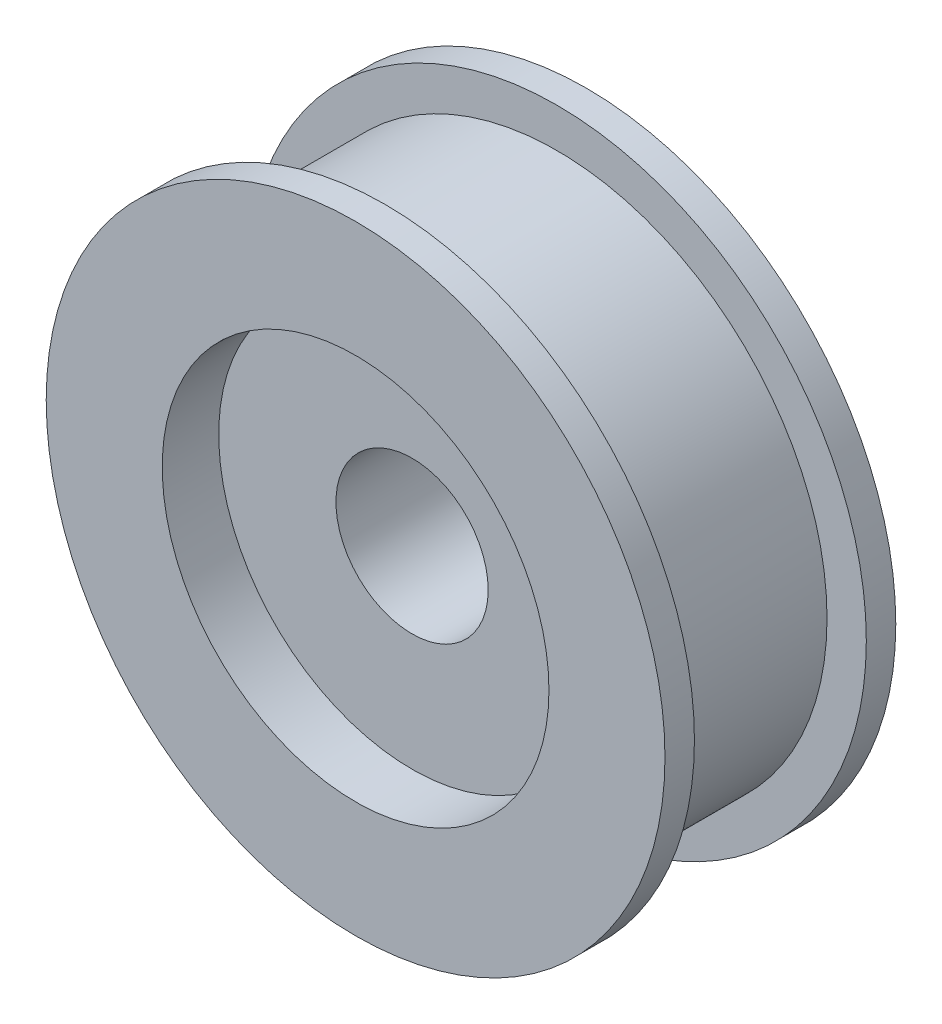
ISO-10303-21;
HEADER;
FILE_DESCRIPTION(('STEP AP214'),'2;1');
FILE_NAME('part.step','',(''),(''),'','','');
FILE_SCHEMA(('AUTOMOTIVE_DESIGN { 1 0 10303 214 1 1 1 1 }'));
ENDSEC;
DATA;
#1=APPLICATION_CONTEXT('core data for automotive mechanical design processes');
#2=APPLICATION_PROTOCOL_DEFINITION('international standard','automotive_design',2000,#1);
#3=PRODUCT_CONTEXT('',#1,'mechanical');
#4=PRODUCT('Part','Part','',(#3));
#5=PRODUCT_RELATED_PRODUCT_CATEGORY('part','',(#4));
#6=PRODUCT_DEFINITION_FORMATION('','',#4);
#7=PRODUCT_DEFINITION_CONTEXT('part definition',#1,'design');
#8=PRODUCT_DEFINITION('design','',#6,#7);
#9=PRODUCT_DEFINITION_SHAPE('','',#8);
#10=(LENGTH_UNIT() NAMED_UNIT(*) SI_UNIT(.MILLI.,.METRE.));
#11=(NAMED_UNIT(*) PLANE_ANGLE_UNIT() SI_UNIT($,.RADIAN.));
#12=(NAMED_UNIT(*) SI_UNIT($,.STERADIAN.) SOLID_ANGLE_UNIT());
#13=UNCERTAINTY_MEASURE_WITH_UNIT(LENGTH_MEASURE(1.E-05),#10,'distance_accuracy_value','');
#14=(GEOMETRIC_REPRESENTATION_CONTEXT(3) GLOBAL_UNCERTAINTY_ASSIGNED_CONTEXT((#13)) GLOBAL_UNIT_ASSIGNED_CONTEXT((#10,
#11,#12)) REPRESENTATION_CONTEXT('',''));
#15=CARTESIAN_POINT('',(0.,0.,0.));
#16=DIRECTION('',(0.,0.,1.));
#17=DIRECTION('',(1.,0.,0.));
#18=AXIS2_PLACEMENT_3D('',#15,#16,#17);
#19=CARTESIAN_POINT('',(0.,0.,-4.7));
#20=DIRECTION('',(0.,0.,1.));
#21=DIRECTION('',(1.,0.,0.));
#22=AXIS2_PLACEMENT_3D('',#19,#20,#21);
#23=CYLINDRICAL_SURFACE('',#22,12.6);
#24=CARTESIAN_POINT('',(0.,0.,-4.7));
#25=DIRECTION('',(0.,0.,1.));
#26=DIRECTION('',(1.,0.,0.));
#27=AXIS2_PLACEMENT_3D('',#24,#25,#26);
#28=CIRCLE('',#27,12.6);
#29=CARTESIAN_POINT('',(12.6,0.,-4.7));
#30=VERTEX_POINT('',#29);
#31=EDGE_CURVE('E50',#30,#30,#28,.T.);
#32=ORIENTED_EDGE('',*,*,#31,.T.);
#33=EDGE_LOOP('',(#32));
#34=FACE_BOUND('',#33,.T.);
#35=CARTESIAN_POINT('',(0.,0.,-3.5));
#36=DIRECTION('',(0.,0.,1.));
#37=DIRECTION('',(1.,0.,0.));
#38=AXIS2_PLACEMENT_3D('',#35,#36,#37);
#39=CIRCLE('',#38,12.6);
#40=CARTESIAN_POINT('',(12.6,0.,-3.5));
#41=VERTEX_POINT('',#40);
#42=EDGE_CURVE('E62',#41,#41,#39,.T.);
#43=ORIENTED_EDGE('',*,*,#42,.F.);
#44=EDGE_LOOP('',(#43));
#45=FACE_BOUND('',#44,.T.);
#46=ADVANCED_FACE('F30',(#34,#45),#23,.T.);
#47=CARTESIAN_POINT('',(0.,0.,2.4));
#48=DIRECTION('',(0.,0.,1.));
#49=DIRECTION('',(1.,0.,0.));
#50=AXIS2_PLACEMENT_3D('',#47,#48,#49);
#51=PLANE('',#50);
#52=CARTESIAN_POINT('',(0.,0.,2.4));
#53=DIRECTION('',(0.,0.,1.));
#54=DIRECTION('',(1.,0.,0.));
#55=AXIS2_PLACEMENT_3D('',#52,#53,#54);
#56=CIRCLE('',#55,7.875);
#57=CARTESIAN_POINT('',(7.875,0.,2.4));
#58=VERTEX_POINT('',#57);
#59=EDGE_CURVE('E46',#58,#58,#56,.T.);
#60=ORIENTED_EDGE('',*,*,#59,.T.);
#61=EDGE_LOOP('',(#60));
#62=FACE_BOUND('',#61,.T.);
#63=CARTESIAN_POINT('',(0.,0.,2.4));
#64=DIRECTION('',(0.,0.,1.));
#65=DIRECTION('',(1.,0.,0.));
#66=AXIS2_PLACEMENT_3D('',#63,#64,#65);
#67=CIRCLE('',#66,3.1);
#68=CARTESIAN_POINT('',(3.1,0.,2.4));
#69=VERTEX_POINT('',#68);
#70=EDGE_CURVE('E37',#69,#69,#67,.T.);
#71=ORIENTED_EDGE('',*,*,#70,.F.);
#72=EDGE_LOOP('',(#71));
#73=FACE_BOUND('',#72,.T.);
#74=ADVANCED_FACE('F87',(#62,#73),#51,.T.);
#75=CARTESIAN_POINT('',(0.,0.,-2.4));
#76=DIRECTION('',(0.,0.,1.));
#77=DIRECTION('',(1.,0.,0.));
#78=AXIS2_PLACEMENT_3D('',#75,#76,#77);
#79=PLANE('',#78);
#80=CARTESIAN_POINT('',(0.,0.,-2.4));
#81=DIRECTION('',(0.,0.,1.));
#82=DIRECTION('',(1.,0.,0.));
#83=AXIS2_PLACEMENT_3D('',#80,#81,#82);
#84=CIRCLE('',#83,7.875);
#85=CARTESIAN_POINT('',(7.875,0.,-2.4));
#86=VERTEX_POINT('',#85);
#87=EDGE_CURVE('E10',#86,#86,#84,.T.);
#88=ORIENTED_EDGE('',*,*,#87,.F.);
#89=EDGE_LOOP('',(#88));
#90=FACE_BOUND('',#89,.T.);
#91=CARTESIAN_POINT('',(0.,0.,-2.4));
#92=DIRECTION('',(0.,0.,1.));
#93=DIRECTION('',(1.,0.,0.));
#94=AXIS2_PLACEMENT_3D('',#91,#92,#93);
#95=CIRCLE('',#94,3.1);
#96=CARTESIAN_POINT('',(3.1,0.,-2.4));
#97=VERTEX_POINT('',#96);
#98=EDGE_CURVE('E41',#97,#97,#95,.T.);
#99=ORIENTED_EDGE('',*,*,#98,.T.);
#100=EDGE_LOOP('',(#99));
#101=FACE_BOUND('',#100,.T.);
#102=ADVANCED_FACE('F32',(#90,#101),#79,.F.);
#103=CARTESIAN_POINT('',(0.,0.,2.4));
#104=DIRECTION('',(0.,0.,-1.));
#105=DIRECTION('',(-1.,0.,0.));
#106=AXIS2_PLACEMENT_3D('',#103,#104,#105);
#107=CYLINDRICAL_SURFACE('',#106,3.1);
#108=ORIENTED_EDGE('',*,*,#70,.T.);
#109=EDGE_LOOP('',(#108));
#110=FACE_BOUND('',#109,.T.);
#111=ORIENTED_EDGE('',*,*,#98,.F.);
#112=EDGE_LOOP('',(#111));
#113=FACE_BOUND('',#112,.T.);
#114=ADVANCED_FACE('F107',(#110,#113),#107,.F.);
#115=CARTESIAN_POINT('',(0.,0.,-4.7));
#116=DIRECTION('',(0.,0.,1.));
#117=DIRECTION('',(1.,0.,0.));
#118=AXIS2_PLACEMENT_3D('',#115,#116,#117);
#119=CYLINDRICAL_SURFACE('',#118,7.875);
#120=CARTESIAN_POINT('',(0.,0.,-4.7));
#121=DIRECTION('',(0.,0.,1.));
#122=DIRECTION('',(1.,0.,0.));
#123=AXIS2_PLACEMENT_3D('',#120,#121,#122);
#124=CIRCLE('',#123,7.875);
#125=CARTESIAN_POINT('',(7.875,0.,-4.7));
#126=VERTEX_POINT('',#125);
#127=EDGE_CURVE('E53',#126,#126,#124,.T.);
#128=ORIENTED_EDGE('',*,*,#127,.F.);
#129=EDGE_LOOP('',(#128));
#130=FACE_BOUND('',#129,.T.);
#131=ORIENTED_EDGE('',*,*,#87,.T.);
#132=EDGE_LOOP('',(#131));
#133=FACE_BOUND('',#132,.T.);
#134=ADVANCED_FACE('F99',(#130,#133),#119,.F.);
#135=CARTESIAN_POINT('',(0.,0.,3.5));
#136=DIRECTION('',(0.,0.,1.));
#137=DIRECTION('',(1.,0.,0.));
#138=AXIS2_PLACEMENT_3D('',#135,#136,#137);
#139=CIRCLE('',#138,12.6);
#140=CARTESIAN_POINT('',(12.6,0.,3.5));
#141=VERTEX_POINT('',#140);
#142=EDGE_CURVE('E63',#141,#141,#139,.T.);
#143=ORIENTED_EDGE('',*,*,#142,.T.);
#144=EDGE_LOOP('',(#143));
#145=FACE_BOUND('',#144,.T.);
#146=CARTESIAN_POINT('',(0.,0.,4.7));
#147=DIRECTION('',(0.,0.,1.));
#148=DIRECTION('',(1.,0.,0.));
#149=AXIS2_PLACEMENT_3D('',#146,#147,#148);
#150=CIRCLE('',#149,12.6);
#151=CARTESIAN_POINT('',(12.6,0.,4.7));
#152=VERTEX_POINT('',#151);
#153=EDGE_CURVE('E56',#152,#152,#150,.T.);
#154=ORIENTED_EDGE('',*,*,#153,.F.);
#155=EDGE_LOOP('',(#154));
#156=FACE_BOUND('',#155,.T.);
#157=ADVANCED_FACE('F90',(#145,#156),#23,.T.);
#158=CARTESIAN_POINT('',(0.,0.,-4.7));
#159=DIRECTION('',(0.,0.,1.));
#160=DIRECTION('',(1.,0.,0.));
#161=AXIS2_PLACEMENT_3D('',#158,#159,#160);
#162=PLANE('',#161);
#163=ORIENTED_EDGE('',*,*,#127,.T.);
#164=EDGE_LOOP('',(#163));
#165=FACE_BOUND('',#164,.T.);
#166=ORIENTED_EDGE('',*,*,#31,.F.);
#167=EDGE_LOOP('',(#166));
#168=FACE_BOUND('',#167,.T.);
#169=ADVANCED_FACE('F98',(#165,#168),#162,.F.);
#170=ORIENTED_EDGE('',*,*,#59,.F.);
#171=EDGE_LOOP('',(#170));
#172=FACE_BOUND('',#171,.T.);
#173=CARTESIAN_POINT('',(0.,0.,4.7));
#174=DIRECTION('',(0.,0.,1.));
#175=DIRECTION('',(1.,0.,0.));
#176=AXIS2_PLACEMENT_3D('',#173,#174,#175);
#177=CIRCLE('',#176,7.875);
#178=CARTESIAN_POINT('',(7.875,0.,4.7));
#179=VERTEX_POINT('',#178);
#180=EDGE_CURVE('E59',#179,#179,#177,.T.);
#181=ORIENTED_EDGE('',*,*,#180,.T.);
#182=EDGE_LOOP('',(#181));
#183=FACE_BOUND('',#182,.T.);
#184=ADVANCED_FACE('F105',(#172,#183),#119,.F.);
#185=CARTESIAN_POINT('',(0.,0.,4.7));
#186=DIRECTION('',(0.,0.,1.));
#187=DIRECTION('',(1.,0.,0.));
#188=AXIS2_PLACEMENT_3D('',#185,#186,#187);
#189=PLANE('',#188);
#190=ORIENTED_EDGE('',*,*,#153,.T.);
#191=EDGE_LOOP('',(#190));
#192=FACE_BOUND('',#191,.T.);
#193=ORIENTED_EDGE('',*,*,#180,.F.);
#194=EDGE_LOOP('',(#193));
#195=FACE_BOUND('',#194,.T.);
#196=ADVANCED_FACE('F82',(#192,#195),#189,.T.);
#197=CARTESIAN_POINT('',(0.,0.,-3.5));
#198=DIRECTION('',(0.,0.,1.));
#199=DIRECTION('',(1.,0.,0.));
#200=AXIS2_PLACEMENT_3D('',#197,#198,#199);
#201=PLANE('',#200);
#202=CARTESIAN_POINT('',(0.,0.,-3.5));
#203=DIRECTION('',(0.,0.,1.));
#204=DIRECTION('',(1.,0.,0.));
#205=AXIS2_PLACEMENT_3D('',#202,#203,#204);
#206=CIRCLE('',#205,11.);
#207=CARTESIAN_POINT('',(11.,0.,-3.5));
#208=VERTEX_POINT('',#207);
#209=EDGE_CURVE('E66',#208,#208,#206,.T.);
#210=ORIENTED_EDGE('',*,*,#209,.F.);
#211=EDGE_LOOP('',(#210));
#212=FACE_BOUND('',#211,.T.);
#213=ORIENTED_EDGE('',*,*,#42,.T.);
#214=EDGE_LOOP('',(#213));
#215=FACE_BOUND('',#214,.T.);
#216=ADVANCED_FACE('F78',(#212,#215),#201,.T.);
#217=CARTESIAN_POINT('',(0.,0.,3.5));
#218=DIRECTION('',(0.,0.,1.));
#219=DIRECTION('',(1.,0.,0.));
#220=AXIS2_PLACEMENT_3D('',#217,#218,#219);
#221=PLANE('',#220);
#222=CARTESIAN_POINT('',(0.,0.,3.5));
#223=DIRECTION('',(0.,0.,1.));
#224=DIRECTION('',(1.,0.,0.));
#225=AXIS2_PLACEMENT_3D('',#222,#223,#224);
#226=CIRCLE('',#225,11.);
#227=CARTESIAN_POINT('',(11.,0.,3.5));
#228=VERTEX_POINT('',#227);
#229=EDGE_CURVE('E69',#228,#228,#226,.T.);
#230=ORIENTED_EDGE('',*,*,#229,.T.);
#231=EDGE_LOOP('',(#230));
#232=FACE_BOUND('',#231,.T.);
#233=ORIENTED_EDGE('',*,*,#142,.F.);
#234=EDGE_LOOP('',(#233));
#235=FACE_BOUND('',#234,.T.);
#236=ADVANCED_FACE('F81',(#232,#235),#221,.F.);
#237=CARTESIAN_POINT('',(0.,0.,-3.5));
#238=DIRECTION('',(0.,0.,1.));
#239=DIRECTION('',(1.,0.,0.));
#240=AXIS2_PLACEMENT_3D('',#237,#238,#239);
#241=CYLINDRICAL_SURFACE('',#240,11.);
#242=ORIENTED_EDGE('',*,*,#209,.T.);
#243=EDGE_LOOP('',(#242));
#244=FACE_BOUND('',#243,.T.);
#245=ORIENTED_EDGE('',*,*,#229,.F.);
#246=EDGE_LOOP('',(#245));
#247=FACE_BOUND('',#246,.T.);
#248=ADVANCED_FACE('F75',(#244,#247),#241,.T.);
#249=CLOSED_SHELL('',(#46,#74,#102,#114,#134,#157,#169,#184,#196,#216,#236,#248));
#250=MANIFOLD_SOLID_BREP('B2',#249);
#251=ADVANCED_BREP_SHAPE_REPRESENTATION('',(#18,#250),#14);
#252=SHAPE_DEFINITION_REPRESENTATION(#9,#251);
ENDSEC;
END-ISO-10303-21;
